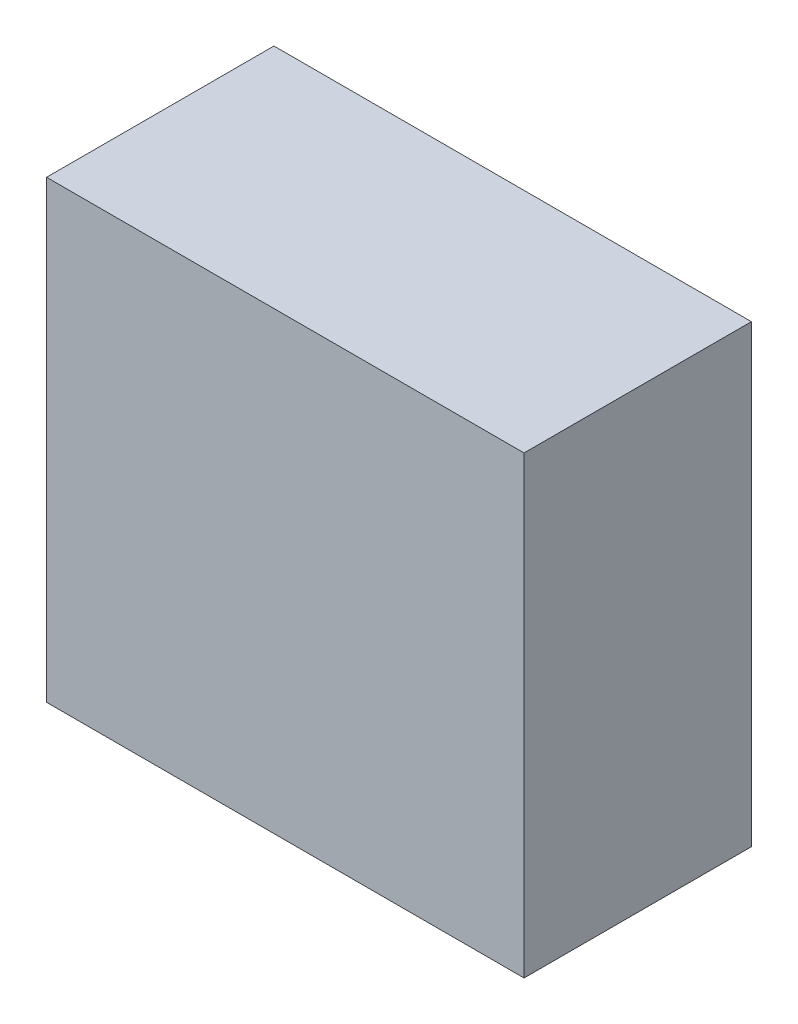
ISO-10303-21;
HEADER;
FILE_DESCRIPTION(('STEP AP214'),'2;1');
FILE_NAME('part.step','',(''),(''),'','','');
FILE_SCHEMA(('AUTOMOTIVE_DESIGN { 1 0 10303 214 1 1 1 1 }'));
ENDSEC;
DATA;
#1=APPLICATION_CONTEXT('core data for automotive mechanical design processes');
#2=APPLICATION_PROTOCOL_DEFINITION('international standard','automotive_design',2000,#1);
#3=PRODUCT_CONTEXT('',#1,'mechanical');
#4=PRODUCT('Part','Part','',(#3));
#5=PRODUCT_RELATED_PRODUCT_CATEGORY('part','',(#4));
#6=PRODUCT_DEFINITION_FORMATION('','',#4);
#7=PRODUCT_DEFINITION_CONTEXT('part definition',#1,'design');
#8=PRODUCT_DEFINITION('design','',#6,#7);
#9=PRODUCT_DEFINITION_SHAPE('','',#8);
#10=(LENGTH_UNIT() NAMED_UNIT(*) SI_UNIT(.MILLI.,.METRE.));
#11=(NAMED_UNIT(*) PLANE_ANGLE_UNIT() SI_UNIT($,.RADIAN.));
#12=(NAMED_UNIT(*) SI_UNIT($,.STERADIAN.) SOLID_ANGLE_UNIT());
#13=UNCERTAINTY_MEASURE_WITH_UNIT(LENGTH_MEASURE(1.E-05),#10,'distance_accuracy_value','');
#14=(GEOMETRIC_REPRESENTATION_CONTEXT(3) GLOBAL_UNCERTAINTY_ASSIGNED_CONTEXT((#13)) GLOBAL_UNIT_ASSIGNED_CONTEXT((#10,
#11,#12)) REPRESENTATION_CONTEXT('',''));
#15=CARTESIAN_POINT('',(0.,0.,0.));
#16=DIRECTION('',(0.,0.,1.));
#17=DIRECTION('',(1.,0.,0.));
#18=AXIS2_PLACEMENT_3D('',#15,#16,#17);
#19=CARTESIAN_POINT('',(-21.,20.,20.));
#20=DIRECTION('',(0.,1.,0.));
#21=DIRECTION('',(0.,0.,1.));
#22=AXIS2_PLACEMENT_3D('',#19,#20,#21);
#23=PLANE('',#22);
#24=DIRECTION('',(1.,0.,0.));
#25=VECTOR('',#24,1.);
#26=CARTESIAN_POINT('',(-21.,20.,0.));
#27=LINE('',#26,#25);
#28=CARTESIAN_POINT('',(-21.,20.,0.));
#29=VERTEX_POINT('',#28);
#30=CARTESIAN_POINT('',(21.,20.,0.));
#31=VERTEX_POINT('',#30);
#32=EDGE_CURVE('E101',#29,#31,#27,.T.);
#33=ORIENTED_EDGE('',*,*,#32,.F.);
#34=DIRECTION('',(0.,0.,-1.));
#35=VECTOR('',#34,1.);
#36=CARTESIAN_POINT('',(-21.,20.,20.));
#37=LINE('',#36,#35);
#38=CARTESIAN_POINT('',(-21.,20.,20.));
#39=VERTEX_POINT('',#38);
#40=EDGE_CURVE('E11',#39,#29,#37,.T.);
#41=ORIENTED_EDGE('',*,*,#40,.F.);
#42=DIRECTION('',(1.,0.,0.));
#43=VECTOR('',#42,1.);
#44=CARTESIAN_POINT('',(-21.,20.,20.));
#45=LINE('',#44,#43);
#46=CARTESIAN_POINT('',(21.,20.,20.));
#47=VERTEX_POINT('',#46);
#48=EDGE_CURVE('E95',#39,#47,#45,.T.);
#49=ORIENTED_EDGE('',*,*,#48,.T.);
#50=DIRECTION('',(0.,0.,-1.));
#51=VECTOR('',#50,1.);
#52=CARTESIAN_POINT('',(21.,20.,20.));
#53=LINE('',#52,#51);
#54=EDGE_CURVE('E40',#47,#31,#53,.T.);
#55=ORIENTED_EDGE('',*,*,#54,.T.);
#56=EDGE_LOOP('',(#33,#41,#49,#55));
#57=FACE_BOUND('',#56,.T.);
#58=ADVANCED_FACE('F37',(#57),#23,.T.);
#59=CARTESIAN_POINT('',(-21.,-20.,20.));
#60=DIRECTION('',(-1.,0.,0.));
#61=DIRECTION('',(0.,0.,1.));
#62=AXIS2_PLACEMENT_3D('',#59,#60,#61);
#63=PLANE('',#62);
#64=DIRECTION('',(0.,1.,0.));
#65=VECTOR('',#64,1.);
#66=CARTESIAN_POINT('',(-21.,-20.,0.));
#67=LINE('',#66,#65);
#68=CARTESIAN_POINT('',(-21.,-20.,0.));
#69=VERTEX_POINT('',#68);
#70=EDGE_CURVE('E97',#69,#29,#67,.T.);
#71=ORIENTED_EDGE('',*,*,#70,.F.);
#72=DIRECTION('',(0.,0.,-1.));
#73=VECTOR('',#72,1.);
#74=CARTESIAN_POINT('',(-21.,-20.,20.));
#75=LINE('',#74,#73);
#76=CARTESIAN_POINT('',(-21.,-20.,20.));
#77=VERTEX_POINT('',#76);
#78=EDGE_CURVE('E46',#77,#69,#75,.T.);
#79=ORIENTED_EDGE('',*,*,#78,.F.);
#80=DIRECTION('',(0.,1.,0.));
#81=VECTOR('',#80,1.);
#82=CARTESIAN_POINT('',(-21.,-20.,20.));
#83=LINE('',#82,#81);
#84=EDGE_CURVE('E85',#77,#39,#83,.T.);
#85=ORIENTED_EDGE('',*,*,#84,.T.);
#86=ORIENTED_EDGE('',*,*,#40,.T.);
#87=EDGE_LOOP('',(#71,#79,#85,#86));
#88=FACE_BOUND('',#87,.T.);
#89=ADVANCED_FACE('F111',(#88),#63,.T.);
#90=CARTESIAN_POINT('',(-21.,-20.,20.));
#91=DIRECTION('',(0.,1.,0.));
#92=DIRECTION('',(0.,0.,1.));
#93=AXIS2_PLACEMENT_3D('',#90,#91,#92);
#94=PLANE('',#93);
#95=DIRECTION('',(1.,0.,0.));
#96=VECTOR('',#95,1.);
#97=CARTESIAN_POINT('',(-21.,-20.,0.));
#98=LINE('',#97,#96);
#99=CARTESIAN_POINT('',(21.,-20.,0.));
#100=VERTEX_POINT('',#99);
#101=EDGE_CURVE('E90',#69,#100,#98,.T.);
#102=ORIENTED_EDGE('',*,*,#101,.T.);
#103=DIRECTION('',(0.,0.,-1.));
#104=VECTOR('',#103,1.);
#105=CARTESIAN_POINT('',(21.,-20.,20.));
#106=LINE('',#105,#104);
#107=CARTESIAN_POINT('',(21.,-20.,20.));
#108=VERTEX_POINT('',#107);
#109=EDGE_CURVE('E88',#108,#100,#106,.T.);
#110=ORIENTED_EDGE('',*,*,#109,.F.);
#111=DIRECTION('',(1.,0.,0.));
#112=VECTOR('',#111,1.);
#113=CARTESIAN_POINT('',(-21.,-20.,20.));
#114=LINE('',#113,#112);
#115=EDGE_CURVE('E82',#77,#108,#114,.T.);
#116=ORIENTED_EDGE('',*,*,#115,.F.);
#117=ORIENTED_EDGE('',*,*,#78,.T.);
#118=EDGE_LOOP('',(#102,#110,#116,#117));
#119=FACE_BOUND('',#118,.T.);
#120=ADVANCED_FACE('F89',(#119),#94,.F.);
#121=CARTESIAN_POINT('',(21.,-20.,20.));
#122=DIRECTION('',(-1.,0.,0.));
#123=DIRECTION('',(0.,0.,1.));
#124=AXIS2_PLACEMENT_3D('',#121,#122,#123);
#125=PLANE('',#124);
#126=DIRECTION('',(0.,1.,0.));
#127=VECTOR('',#126,1.);
#128=CARTESIAN_POINT('',(21.,-20.,0.));
#129=LINE('',#128,#127);
#130=EDGE_CURVE('E104',#100,#31,#129,.T.);
#131=ORIENTED_EDGE('',*,*,#130,.T.);
#132=ORIENTED_EDGE('',*,*,#54,.F.);
#133=DIRECTION('',(0.,1.,0.));
#134=VECTOR('',#133,1.);
#135=CARTESIAN_POINT('',(21.,-20.,20.));
#136=LINE('',#135,#134);
#137=EDGE_CURVE('E79',#108,#47,#136,.T.);
#138=ORIENTED_EDGE('',*,*,#137,.F.);
#139=ORIENTED_EDGE('',*,*,#109,.T.);
#140=EDGE_LOOP('',(#131,#132,#138,#139));
#141=FACE_BOUND('',#140,.T.);
#142=ADVANCED_FACE('F94',(#141),#125,.F.);
#143=CARTESIAN_POINT('',(0.,0.,20.));
#144=DIRECTION('',(0.,0.,1.));
#145=DIRECTION('',(1.,0.,0.));
#146=AXIS2_PLACEMENT_3D('',#143,#144,#145);
#147=PLANE('',#146);
#148=ORIENTED_EDGE('',*,*,#48,.F.);
#149=ORIENTED_EDGE('',*,*,#84,.F.);
#150=ORIENTED_EDGE('',*,*,#115,.T.);
#151=ORIENTED_EDGE('',*,*,#137,.T.);
#152=EDGE_LOOP('',(#148,#149,#150,#151));
#153=FACE_BOUND('',#152,.T.);
#154=ADVANCED_FACE('F84',(#153),#147,.T.);
#155=CARTESIAN_POINT('',(0.,0.,0.));
#156=DIRECTION('',(0.,0.,1.));
#157=DIRECTION('',(1.,0.,0.));
#158=AXIS2_PLACEMENT_3D('',#155,#156,#157);
#159=PLANE('',#158);
#160=ORIENTED_EDGE('',*,*,#32,.T.);
#161=ORIENTED_EDGE('',*,*,#130,.F.);
#162=ORIENTED_EDGE('',*,*,#101,.F.);
#163=ORIENTED_EDGE('',*,*,#70,.T.);
#164=EDGE_LOOP('',(#160,#161,#162,#163));
#165=FACE_BOUND('',#164,.T.);
#166=ADVANCED_FACE('F110',(#165),#159,.F.);
#167=CLOSED_SHELL('',(#58,#89,#120,#142,#154,#166));
#168=MANIFOLD_SOLID_BREP('B2',#167);
#169=ADVANCED_BREP_SHAPE_REPRESENTATION('',(#18,#168),#14);
#170=SHAPE_DEFINITION_REPRESENTATION(#9,#169);
ENDSEC;
END-ISO-10303-21;
